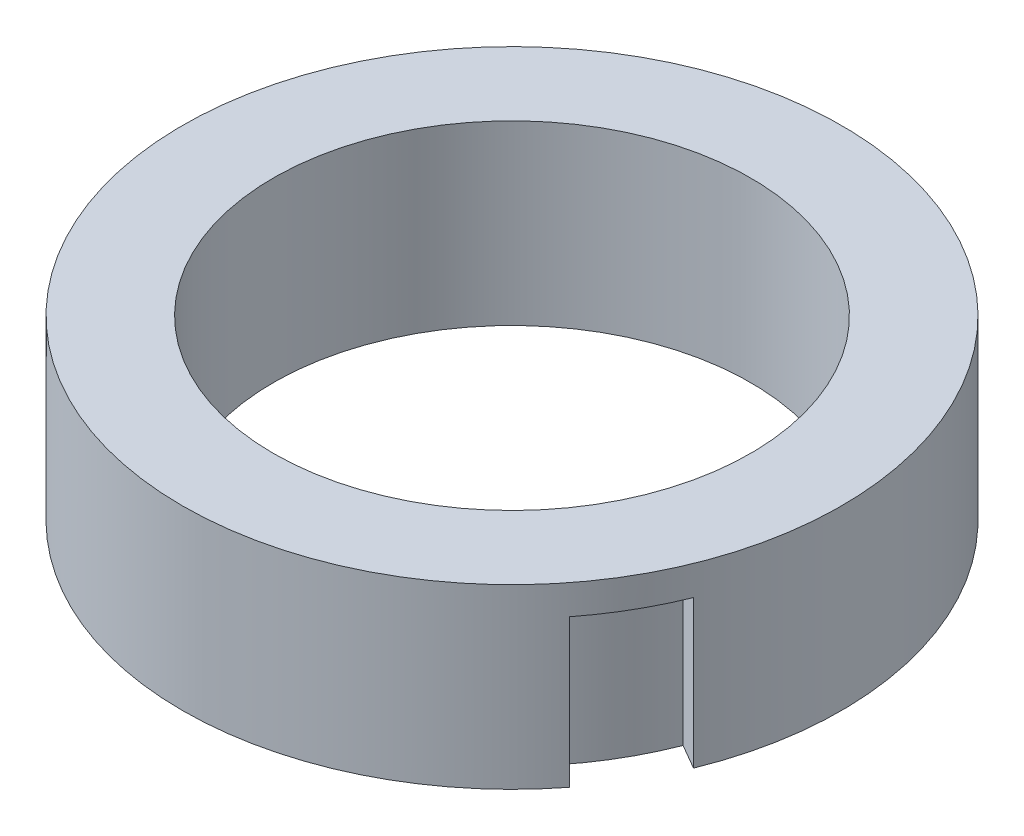
ISO-10303-21;
HEADER;
FILE_DESCRIPTION(('STEP AP214'),'2;1');
FILE_NAME('part.step','',(''),(''),'','','');
FILE_SCHEMA(('AUTOMOTIVE_DESIGN { 1 0 10303 214 1 1 1 1 }'));
ENDSEC;
DATA;
#1=APPLICATION_CONTEXT('core data for automotive mechanical design processes');
#2=APPLICATION_PROTOCOL_DEFINITION('international standard','automotive_design',2000,#1);
#3=PRODUCT_CONTEXT('',#1,'mechanical');
#4=PRODUCT('Part','Part','',(#3));
#5=PRODUCT_RELATED_PRODUCT_CATEGORY('part','',(#4));
#6=PRODUCT_DEFINITION_FORMATION('','',#4);
#7=PRODUCT_DEFINITION_CONTEXT('part definition',#1,'design');
#8=PRODUCT_DEFINITION('design','',#6,#7);
#9=PRODUCT_DEFINITION_SHAPE('','',#8);
#10=(LENGTH_UNIT() NAMED_UNIT(*) SI_UNIT(.MILLI.,.METRE.));
#11=(NAMED_UNIT(*) PLANE_ANGLE_UNIT() SI_UNIT($,.RADIAN.));
#12=(NAMED_UNIT(*) SI_UNIT($,.STERADIAN.) SOLID_ANGLE_UNIT());
#13=UNCERTAINTY_MEASURE_WITH_UNIT(LENGTH_MEASURE(1.E-05),#10,'distance_accuracy_value','');
#14=(GEOMETRIC_REPRESENTATION_CONTEXT(3) GLOBAL_UNCERTAINTY_ASSIGNED_CONTEXT((#13)) GLOBAL_UNIT_ASSIGNED_CONTEXT((#10,
#11,#12)) REPRESENTATION_CONTEXT('',''));
#15=CARTESIAN_POINT('',(0.,0.,0.));
#16=DIRECTION('',(0.,0.,1.));
#17=DIRECTION('',(1.,0.,0.));
#18=AXIS2_PLACEMENT_3D('',#15,#16,#17);
#19=CARTESIAN_POINT('',(0.,-6.5,0.));
#20=DIRECTION('',(0.,1.,0.));
#21=DIRECTION('',(0.,0.,1.));
#22=AXIS2_PLACEMENT_3D('',#19,#20,#21);
#23=CYLINDRICAL_SURFACE('',#22,13.25);
#24=CARTESIAN_POINT('',(0.,0.,0.));
#25=DIRECTION('',(0.,1.,0.));
#26=DIRECTION('',(0.,0.,1.));
#27=AXIS2_PLACEMENT_3D('',#24,#25,#26);
#28=CIRCLE('',#27,13.25);
#29=CARTESIAN_POINT('',(10.3433625966906,0.,8.28114425628375));
#30=VERTEX_POINT('',#29);
#31=CARTESIAN_POINT('',(12.3433625966906,0.,4.81704264114599));
#32=VERTEX_POINT('',#31);
#33=EDGE_CURVE('E126',#30,#32,#28,.T.);
#34=ORIENTED_EDGE('',*,*,#33,.F.);
#35=DIRECTION('',(0.,1.,0.));
#36=VECTOR('',#35,1.);
#37=CARTESIAN_POINT('',(10.3433625966906,-6.5,8.28114425628375));
#38=LINE('',#37,#36);
#39=CARTESIAN_POINT('',(10.3433625966906,-6.5,8.28114425628375));
#40=VERTEX_POINT('',#39);
#41=EDGE_CURVE('E11',#40,#30,#38,.T.);
#42=ORIENTED_EDGE('',*,*,#41,.F.);
#43=CARTESIAN_POINT('',(0.,-6.5,0.));
#44=DIRECTION('',(0.,1.,0.));
#45=DIRECTION('',(0.,0.,1.));
#46=AXIS2_PLACEMENT_3D('',#43,#44,#45);
#47=CIRCLE('',#46,13.25);
#48=CARTESIAN_POINT('',(12.3433625966906,-6.5,4.81704264114599));
#49=VERTEX_POINT('',#48);
#50=EDGE_CURVE('E213',#40,#49,#47,.T.);
#51=ORIENTED_EDGE('',*,*,#50,.T.);
#52=DIRECTION('',(0.,1.,0.));
#53=VECTOR('',#52,1.);
#54=CARTESIAN_POINT('',(12.3433625966906,-6.5,4.81704264114599));
#55=LINE('',#54,#53);
#56=EDGE_CURVE('E39',#49,#32,#55,.T.);
#57=ORIENTED_EDGE('',*,*,#56,.T.);
#58=EDGE_LOOP('',(#34,#42,#51,#57));
#59=FACE_BOUND('',#58,.T.);
#60=ADVANCED_FACE('F35',(#59),#23,.T.);
#61=CARTESIAN_POINT('',(-1.,-6.5,1.73205080756888));
#62=DIRECTION('',(-0.5,0.,0.866025403784439));
#63=DIRECTION('',(0.866025403784439,0.,0.5));
#64=AXIS2_PLACEMENT_3D('',#61,#62,#63);
#65=PLANE('',#64);
#66=DIRECTION('',(0.866025403784439,0.,0.5));
#67=VECTOR('',#66,1.);
#68=CARTESIAN_POINT('',(-1.,0.,1.73205080756888));
#69=LINE('',#68,#67);
#70=CARTESIAN_POINT('',(11.4373429638328,0.,8.91275411574141));
#71=VERTEX_POINT('',#70);
#72=EDGE_CURVE('E176',#30,#71,#69,.T.);
#73=ORIENTED_EDGE('',*,*,#72,.T.);
#74=DIRECTION('',(0.,1.,0.));
#75=VECTOR('',#74,1.);
#76=CARTESIAN_POINT('',(11.4373429638328,-6.5,8.91275411574141));
#77=LINE('',#76,#75);
#78=CARTESIAN_POINT('',(11.4373429638328,-6.5,8.91275411574141));
#79=VERTEX_POINT('',#78);
#80=EDGE_CURVE('E45',#79,#71,#77,.T.);
#81=ORIENTED_EDGE('',*,*,#80,.F.);
#82=DIRECTION('',(0.866025403784439,0.,0.5));
#83=VECTOR('',#82,1.);
#84=CARTESIAN_POINT('',(-1.,-6.5,1.73205080756888));
#85=LINE('',#84,#83);
#86=EDGE_CURVE('E153',#40,#79,#85,.T.);
#87=ORIENTED_EDGE('',*,*,#86,.F.);
#88=ORIENTED_EDGE('',*,*,#41,.T.);
#89=EDGE_LOOP('',(#73,#81,#87,#88));
#90=FACE_BOUND('',#89,.T.);
#91=ADVANCED_FACE('F226',(#90),#65,.F.);
#92=CARTESIAN_POINT('',(0.,-6.5,0.));
#93=DIRECTION('',(0.,1.,0.));
#94=DIRECTION('',(0.,0.,1.));
#95=AXIS2_PLACEMENT_3D('',#92,#93,#94);
#96=CYLINDRICAL_SURFACE('',#95,14.5);
#97=ORIENTED_EDGE('',*,*,#80,.T.);
#98=CARTESIAN_POINT('',(0.,0.,0.));
#99=DIRECTION('',(0.,1.,0.));
#100=DIRECTION('',(0.,0.,1.));
#101=AXIS2_PLACEMENT_3D('',#98,#99,#100);
#102=CIRCLE('',#101,14.5);
#103=CARTESIAN_POINT('',(13.4373429638328,0.,5.44865250060366));
#104=VERTEX_POINT('',#103);
#105=EDGE_CURVE('E124',#71,#104,#102,.T.);
#106=ORIENTED_EDGE('',*,*,#105,.T.);
#107=DIRECTION('',(0.,1.,0.));
#108=VECTOR('',#107,1.);
#109=CARTESIAN_POINT('',(13.4373429638328,-6.5,5.44865250060366));
#110=LINE('',#109,#108);
#111=CARTESIAN_POINT('',(13.4373429638328,-6.5,5.44865250060366));
#112=VERTEX_POINT('',#111);
#113=EDGE_CURVE('E136',#112,#104,#110,.T.);
#114=ORIENTED_EDGE('',*,*,#113,.F.);
#115=CARTESIAN_POINT('',(0.,-6.5,0.));
#116=DIRECTION('',(0.,1.,0.));
#117=DIRECTION('',(0.,0.,1.));
#118=AXIS2_PLACEMENT_3D('',#115,#116,#117);
#119=CIRCLE('',#118,14.5);
#120=CARTESIAN_POINT('',(2.,-6.5,-14.3614066163451));
#121=VERTEX_POINT('',#120);
#122=EDGE_CURVE('E210',#112,#121,#119,.T.);
#123=ORIENTED_EDGE('',*,*,#122,.T.);
#124=DIRECTION('',(0.,1.,0.));
#125=VECTOR('',#124,1.);
#126=CARTESIAN_POINT('',(2.,-6.5,-14.3614066163451));
#127=LINE('',#126,#125);
#128=CARTESIAN_POINT('',(2.,0.,-14.3614066163451));
#129=VERTEX_POINT('',#128);
#130=EDGE_CURVE('E149',#121,#129,#127,.T.);
#131=ORIENTED_EDGE('',*,*,#130,.T.);
#132=CARTESIAN_POINT('',(-2.,0.,-14.3614066163451));
#133=VERTEX_POINT('',#132);
#134=EDGE_CURVE('E142',#129,#133,#102,.T.);
#135=ORIENTED_EDGE('',*,*,#134,.T.);
#136=DIRECTION('',(0.,1.,0.));
#137=VECTOR('',#136,1.);
#138=CARTESIAN_POINT('',(-2.,-6.5,-14.3614066163451));
#139=LINE('',#138,#137);
#140=CARTESIAN_POINT('',(-2.,-6.5,-14.3614066163451));
#141=VERTEX_POINT('',#140);
#142=EDGE_CURVE('E160',#141,#133,#139,.T.);
#143=ORIENTED_EDGE('',*,*,#142,.F.);
#144=CARTESIAN_POINT('',(0.,-6.5,0.));
#145=DIRECTION('',(0.,1.,0.));
#146=DIRECTION('',(0.,0.,1.));
#147=AXIS2_PLACEMENT_3D('',#144,#145,#146);
#148=CIRCLE('',#147,14.5);
#149=CARTESIAN_POINT('',(-13.4373429638327,-6.5,5.44865250060367));
#150=VERTEX_POINT('',#149);
#151=EDGE_CURVE('E201',#141,#150,#148,.T.);
#152=ORIENTED_EDGE('',*,*,#151,.T.);
#153=DIRECTION('',(0.,1.,0.));
#154=VECTOR('',#153,1.);
#155=CARTESIAN_POINT('',(-13.4373429638327,-6.5,5.44865250060367));
#156=LINE('',#155,#154);
#157=CARTESIAN_POINT('',(-13.4373429638327,0.,5.44865250060367));
#158=VERTEX_POINT('',#157);
#159=EDGE_CURVE('E163',#150,#158,#156,.T.);
#160=ORIENTED_EDGE('',*,*,#159,.T.);
#161=CARTESIAN_POINT('',(-11.4373429638327,0.,8.91275411574142));
#162=VERTEX_POINT('',#161);
#163=EDGE_CURVE('E144',#158,#162,#102,.T.);
#164=ORIENTED_EDGE('',*,*,#163,.T.);
#165=DIRECTION('',(0.,1.,0.));
#166=VECTOR('',#165,1.);
#167=CARTESIAN_POINT('',(-11.4373429638327,-6.5,8.91275411574142));
#168=LINE('',#167,#166);
#169=CARTESIAN_POINT('',(-11.4373429638327,-6.5,8.91275411574142));
#170=VERTEX_POINT('',#169);
#171=EDGE_CURVE('E172',#170,#162,#168,.T.);
#172=ORIENTED_EDGE('',*,*,#171,.F.);
#173=CARTESIAN_POINT('',(0.,-6.5,0.));
#174=DIRECTION('',(0.,1.,0.));
#175=DIRECTION('',(0.,0.,1.));
#176=AXIS2_PLACEMENT_3D('',#173,#174,#175);
#177=CIRCLE('',#176,14.5);
#178=EDGE_CURVE('E193',#170,#79,#177,.T.);
#179=ORIENTED_EDGE('',*,*,#178,.T.);
#180=EDGE_LOOP('',(#97,#106,#114,#123,#131,#135,#143,#152,#160,#164,#172,#179));
#181=FACE_BOUND('',#180,.T.);
#182=CARTESIAN_POINT('',(0.,1.3,0.));
#183=DIRECTION('',(0.,1.,0.));
#184=DIRECTION('',(0.,0.,1.));
#185=AXIS2_PLACEMENT_3D('',#182,#183,#184);
#186=CIRCLE('',#185,14.5);
#187=CARTESIAN_POINT('',(0.,1.3,14.5));
#188=VERTEX_POINT('',#187);
#189=EDGE_CURVE('E141',#188,#188,#186,.T.);
#190=ORIENTED_EDGE('',*,*,#189,.F.);
#191=EDGE_LOOP('',(#190));
#192=FACE_BOUND('',#191,.T.);
#193=ADVANCED_FACE('F133',(#181,#192),#96,.T.);
#194=CARTESIAN_POINT('',(0.999999999999998,-6.5,1.73205080756887));
#195=DIRECTION('',(-0.500000000000001,0.,-0.866025403784438));
#196=DIRECTION('',(-0.866025403784438,0.,0.500000000000001));
#197=AXIS2_PLACEMENT_3D('',#194,#195,#196);
#198=PLANE('',#197);
#199=DIRECTION('',(-0.866025403784438,0.,0.500000000000001));
#200=VECTOR('',#199,1.);
#201=CARTESIAN_POINT('',(0.999999999999998,0.,1.73205080756887));
#202=LINE('',#201,#200);
#203=CARTESIAN_POINT('',(-10.3433625966906,0.,8.28114425628375));
#204=VERTEX_POINT('',#203);
#205=EDGE_CURVE('E179',#204,#162,#202,.T.);
#206=ORIENTED_EDGE('',*,*,#205,.F.);
#207=DIRECTION('',(0.,1.,0.));
#208=VECTOR('',#207,1.);
#209=CARTESIAN_POINT('',(-10.3433625966906,-6.5,8.28114425628375));
#210=LINE('',#209,#208);
#211=CARTESIAN_POINT('',(-10.3433625966906,-6.5,8.28114425628375));
#212=VERTEX_POINT('',#211);
#213=EDGE_CURVE('E169',#212,#204,#210,.T.);
#214=ORIENTED_EDGE('',*,*,#213,.F.);
#215=DIRECTION('',(-0.866025403784438,0.,0.500000000000001));
#216=VECTOR('',#215,1.);
#217=CARTESIAN_POINT('',(0.999999999999998,-6.5,1.73205080756887));
#218=LINE('',#217,#216);
#219=EDGE_CURVE('E195',#212,#170,#218,.T.);
#220=ORIENTED_EDGE('',*,*,#219,.T.);
#221=ORIENTED_EDGE('',*,*,#171,.T.);
#222=EDGE_LOOP('',(#206,#214,#220,#221));
#223=FACE_BOUND('',#222,.T.);
#224=ADVANCED_FACE('F225',(#223),#198,.T.);
#225=CARTESIAN_POINT('',(-12.3433625966906,0.,4.817042641146));
#226=VERTEX_POINT('',#225);
#227=EDGE_CURVE('E181',#226,#204,#28,.T.);
#228=ORIENTED_EDGE('',*,*,#227,.F.);
#229=DIRECTION('',(0.,1.,0.));
#230=VECTOR('',#229,1.);
#231=CARTESIAN_POINT('',(-12.3433625966906,-6.5,4.817042641146));
#232=LINE('',#231,#230);
#233=CARTESIAN_POINT('',(-12.3433625966906,-6.5,4.817042641146));
#234=VERTEX_POINT('',#233);
#235=EDGE_CURVE('E166',#234,#226,#232,.T.);
#236=ORIENTED_EDGE('',*,*,#235,.F.);
#237=EDGE_CURVE('E198',#234,#212,#47,.T.);
#238=ORIENTED_EDGE('',*,*,#237,.T.);
#239=ORIENTED_EDGE('',*,*,#213,.T.);
#240=EDGE_LOOP('',(#228,#236,#238,#239));
#241=FACE_BOUND('',#240,.T.);
#242=ADVANCED_FACE('F232',(#241),#23,.T.);
#243=CARTESIAN_POINT('',(-1.,-6.5,-1.73205080756888));
#244=DIRECTION('',(-0.5,0.,-0.866025403784438));
#245=DIRECTION('',(-0.866025403784439,0.,0.5));
#246=AXIS2_PLACEMENT_3D('',#243,#244,#245);
#247=PLANE('',#246);
#248=DIRECTION('',(-0.866025403784438,0.,0.5));
#249=VECTOR('',#248,1.);
#250=CARTESIAN_POINT('',(-1.,0.,-1.73205080756888));
#251=LINE('',#250,#249);
#252=EDGE_CURVE('E182',#226,#158,#251,.T.);
#253=ORIENTED_EDGE('',*,*,#252,.T.);
#254=ORIENTED_EDGE('',*,*,#159,.F.);
#255=DIRECTION('',(-0.866025403784438,0.,0.5));
#256=VECTOR('',#255,1.);
#257=CARTESIAN_POINT('',(-1.,-6.5,-1.73205080756888));
#258=LINE('',#257,#256);
#259=EDGE_CURVE('E199',#234,#150,#258,.T.);
#260=ORIENTED_EDGE('',*,*,#259,.F.);
#261=ORIENTED_EDGE('',*,*,#235,.T.);
#262=EDGE_LOOP('',(#253,#254,#260,#261));
#263=FACE_BOUND('',#262,.T.);
#264=ADVANCED_FACE('F248',(#263),#247,.F.);
#265=CARTESIAN_POINT('',(-2.,-6.5,0.));
#266=DIRECTION('',(1.,0.,0.));
#267=DIRECTION('',(0.,0.,-1.));
#268=AXIS2_PLACEMENT_3D('',#265,#266,#267);
#269=PLANE('',#268);
#270=DIRECTION('',(0.,0.,-1.));
#271=VECTOR('',#270,1.);
#272=CARTESIAN_POINT('',(-2.,0.,0.));
#273=LINE('',#272,#271);
#274=CARTESIAN_POINT('',(-2.,0.,-13.0981868974297));
#275=VERTEX_POINT('',#274);
#276=EDGE_CURVE('E185',#275,#133,#273,.T.);
#277=ORIENTED_EDGE('',*,*,#276,.F.);
#278=DIRECTION('',(0.,1.,0.));
#279=VECTOR('',#278,1.);
#280=CARTESIAN_POINT('',(-2.,-6.5,-13.0981868974297));
#281=LINE('',#280,#279);
#282=CARTESIAN_POINT('',(-2.,-6.5,-13.0981868974297));
#283=VERTEX_POINT('',#282);
#284=EDGE_CURVE('E157',#283,#275,#281,.T.);
#285=ORIENTED_EDGE('',*,*,#284,.F.);
#286=DIRECTION('',(0.,0.,-1.));
#287=VECTOR('',#286,1.);
#288=CARTESIAN_POINT('',(-2.,-6.5,0.));
#289=LINE('',#288,#287);
#290=EDGE_CURVE('E204',#283,#141,#289,.T.);
#291=ORIENTED_EDGE('',*,*,#290,.T.);
#292=ORIENTED_EDGE('',*,*,#142,.T.);
#293=EDGE_LOOP('',(#277,#285,#291,#292));
#294=FACE_BOUND('',#293,.T.);
#295=ADVANCED_FACE('F245',(#294),#269,.T.);
#296=CARTESIAN_POINT('',(2.,0.,-13.0981868974297));
#297=VERTEX_POINT('',#296);
#298=EDGE_CURVE('E187',#297,#275,#28,.T.);
#299=ORIENTED_EDGE('',*,*,#298,.F.);
#300=DIRECTION('',(0.,1.,0.));
#301=VECTOR('',#300,1.);
#302=CARTESIAN_POINT('',(2.,-6.5,-13.0981868974297));
#303=LINE('',#302,#301);
#304=CARTESIAN_POINT('',(2.,-6.5,-13.0981868974297));
#305=VERTEX_POINT('',#304);
#306=EDGE_CURVE('E151',#305,#297,#303,.T.);
#307=ORIENTED_EDGE('',*,*,#306,.F.);
#308=EDGE_CURVE('E207',#305,#283,#47,.T.);
#309=ORIENTED_EDGE('',*,*,#308,.T.);
#310=ORIENTED_EDGE('',*,*,#284,.T.);
#311=EDGE_LOOP('',(#299,#307,#309,#310));
#312=FACE_BOUND('',#311,.T.);
#313=ADVANCED_FACE('F239',(#312),#23,.T.);
#314=CARTESIAN_POINT('',(2.,-6.5,0.));
#315=DIRECTION('',(1.,0.,0.));
#316=DIRECTION('',(0.,0.,-1.));
#317=AXIS2_PLACEMENT_3D('',#314,#315,#316);
#318=PLANE('',#317);
#319=DIRECTION('',(0.,0.,-1.));
#320=VECTOR('',#319,1.);
#321=CARTESIAN_POINT('',(2.,0.,0.));
#322=LINE('',#321,#320);
#323=EDGE_CURVE('E130',#297,#129,#322,.T.);
#324=ORIENTED_EDGE('',*,*,#323,.T.);
#325=ORIENTED_EDGE('',*,*,#130,.F.);
#326=DIRECTION('',(0.,0.,-1.));
#327=VECTOR('',#326,1.);
#328=CARTESIAN_POINT('',(2.,-6.5,0.));
#329=LINE('',#328,#327);
#330=EDGE_CURVE('E208',#305,#121,#329,.T.);
#331=ORIENTED_EDGE('',*,*,#330,.F.);
#332=ORIENTED_EDGE('',*,*,#306,.T.);
#333=EDGE_LOOP('',(#324,#325,#331,#332));
#334=FACE_BOUND('',#333,.T.);
#335=ADVANCED_FACE('F244',(#334),#318,.F.);
#336=CARTESIAN_POINT('',(0.,-6.5,0.));
#337=DIRECTION('',(0.,1.,0.));
#338=DIRECTION('',(0.,0.,1.));
#339=AXIS2_PLACEMENT_3D('',#336,#337,#338);
#340=CYLINDRICAL_SURFACE('',#339,10.5);
#341=CARTESIAN_POINT('',(0.,-6.5,0.));
#342=DIRECTION('',(0.,1.,0.));
#343=DIRECTION('',(0.,0.,1.));
#344=AXIS2_PLACEMENT_3D('',#341,#342,#343);
#345=CIRCLE('',#344,10.5);
#346=CARTESIAN_POINT('',(0.,-6.5,10.5));
#347=VERTEX_POINT('',#346);
#348=EDGE_CURVE('E178',#347,#347,#345,.T.);
#349=CARTESIAN_POINT('',(0.,1.3,0.));
#350=DIRECTION('',(0.,1.,0.));
#351=DIRECTION('',(0.,0.,1.));
#352=AXIS2_PLACEMENT_3D('',#349,#350,#351);
#353=CIRCLE('',#352,10.5);
#354=CARTESIAN_POINT('',(0.,1.3,10.5));
#355=VERTEX_POINT('',#354);
#356=EDGE_CURVE('E191',#355,#355,#353,.T.);
#357=CARTESIAN_POINT('',(0.,-6.5,10.5));
#358=CARTESIAN_POINT('',(0.,-6.41875,10.5));
#359=CARTESIAN_POINT('',(0.,-6.3375,10.5));
#360=CARTESIAN_POINT('',(0.,-6.175,10.5));
#361=CARTESIAN_POINT('',(0.,-6.09375,10.5));
#362=CARTESIAN_POINT('',(0.,-5.93125,10.5));
#363=CARTESIAN_POINT('',(0.,-5.85,10.5));
#364=CARTESIAN_POINT('',(0.,-5.6875,10.5));
#365=CARTESIAN_POINT('',(0.,-5.60625,10.5));
#366=CARTESIAN_POINT('',(0.,-5.44375,10.5));
#367=CARTESIAN_POINT('',(0.,-5.3625,10.5));
#368=CARTESIAN_POINT('',(0.,-5.2,10.5));
#369=CARTESIAN_POINT('',(0.,-5.11875,10.5));
#370=CARTESIAN_POINT('',(0.,-4.95625,10.5));
#371=CARTESIAN_POINT('',(0.,-4.875,10.5));
#372=CARTESIAN_POINT('',(0.,-4.7125,10.5));
#373=CARTESIAN_POINT('',(0.,-4.63125,10.5));
#374=CARTESIAN_POINT('',(0.,-4.46875,10.5));
#375=CARTESIAN_POINT('',(0.,-4.3875,10.5));
#376=CARTESIAN_POINT('',(0.,-4.225,10.5));
#377=CARTESIAN_POINT('',(0.,-4.14375,10.5));
#378=CARTESIAN_POINT('',(0.,-3.98125,10.5));
#379=CARTESIAN_POINT('',(0.,-3.9,10.5));
#380=CARTESIAN_POINT('',(0.,-3.7375,10.5));
#381=CARTESIAN_POINT('',(0.,-3.65625,10.5));
#382=CARTESIAN_POINT('',(0.,-3.49375,10.5));
#383=CARTESIAN_POINT('',(0.,-3.4125,10.5));
#384=CARTESIAN_POINT('',(0.,-3.25,10.5));
#385=CARTESIAN_POINT('',(0.,-3.16875,10.5));
#386=CARTESIAN_POINT('',(0.,-3.00625,10.5));
#387=CARTESIAN_POINT('',(0.,-2.925,10.5));
#388=CARTESIAN_POINT('',(0.,-2.7625,10.5));
#389=CARTESIAN_POINT('',(0.,-2.68125,10.5));
#390=CARTESIAN_POINT('',(0.,-2.51875,10.5));
#391=CARTESIAN_POINT('',(0.,-2.4375,10.5));
#392=CARTESIAN_POINT('',(0.,-2.275,10.5));
#393=CARTESIAN_POINT('',(0.,-2.19375,10.5));
#394=CARTESIAN_POINT('',(0.,-2.03125,10.5));
#395=CARTESIAN_POINT('',(0.,-1.95,10.5));
#396=CARTESIAN_POINT('',(0.,-1.7875,10.5));
#397=CARTESIAN_POINT('',(0.,-1.70625,10.5));
#398=CARTESIAN_POINT('',(0.,-1.54375,10.5));
#399=CARTESIAN_POINT('',(0.,-1.4625,10.5));
#400=CARTESIAN_POINT('',(0.,-1.3,10.5));
#401=CARTESIAN_POINT('',(0.,-1.21875,10.5));
#402=CARTESIAN_POINT('',(0.,-1.05625,10.5));
#403=CARTESIAN_POINT('',(0.,-0.975,10.5));
#404=CARTESIAN_POINT('',(0.,-0.812500000000001,10.5));
#405=CARTESIAN_POINT('',(0.,-0.731250000000001,10.5));
#406=CARTESIAN_POINT('',(0.,-0.568750000000001,10.5));
#407=CARTESIAN_POINT('',(0.,-0.487500000000001,10.5));
#408=CARTESIAN_POINT('',(0.,-0.325000000000001,10.5));
#409=CARTESIAN_POINT('',(0.,-0.243750000000001,10.5));
#410=CARTESIAN_POINT('',(0.,-0.0812500000000012,10.5));
#411=CARTESIAN_POINT('',(0.,0.,10.5));
#412=CARTESIAN_POINT('',(0.,0.162499999999999,10.5));
#413=CARTESIAN_POINT('',(0.,0.243749999999999,10.5));
#414=CARTESIAN_POINT('',(0.,0.406249999999999,10.5));
#415=CARTESIAN_POINT('',(0.,0.487499999999999,10.5));
#416=CARTESIAN_POINT('',(0.,0.649999999999999,10.5));
#417=CARTESIAN_POINT('',(0.,0.731249999999999,10.5));
#418=CARTESIAN_POINT('',(0.,0.893749999999999,10.5));
#419=CARTESIAN_POINT('',(0.,0.974999999999999,10.5));
#420=CARTESIAN_POINT('',(0.,1.1375,10.5));
#421=CARTESIAN_POINT('',(0.,1.21875,10.5));
#422=CARTESIAN_POINT('',(0.,1.3,10.5));
#423=B_SPLINE_CURVE_WITH_KNOTS('',3,(#357,#358,#359,#360,#361,#362,#363,#364,#365,#366,#367,
#368,#369,#370,#371,#372,#373,#374,#375,#376,#377,#378,#379,#380,#381,#382,#383,#384,#385,#386,
#387,#388,#389,#390,#391,#392,#393,#394,#395,#396,#397,#398,#399,#400,#401,#402,#403,#404,#405,
#406,#407,#408,#409,#410,#411,#412,#413,#414,#415,#416,#417,#418,#419,#420,#421,#422),
.UNSPECIFIED.,.F.,.F.,(4,2,2,2,2,2,2,2,2,2,2,2,2,2,2,2,2,2,2,2,2,2,2,2,2,2,2,2,2,2,2,2,4),(0.,
0.243749999999999,0.487499999999999,0.731249999999999,0.974999999999999,1.21875,1.4625,1.70625,
1.95,2.19375,2.4375,2.68125,2.925,3.16875,3.4125,3.65625,3.9,4.14375,4.3875,4.63125,4.875,
5.11875,5.3625,5.60625,5.85,6.09375,6.3375,6.58125,6.825,7.06875,7.3125,7.55625,7.8),.UNSPECIFIED.);
#424=EDGE_CURVE('BSEAM37',#347,#355,#423,.T.);
#425=ORIENTED_EDGE('',*,*,#348,.F.);
#426=ORIENTED_EDGE('',*,*,#356,.T.);
#427=ORIENTED_EDGE('',*,*,#424,.T.);
#428=ORIENTED_EDGE('',*,*,#424,.F.);
#429=EDGE_LOOP('',(#425,#427,#426,#428));
#430=FACE_BOUND('',#429,.T.);
#431=ADVANCED_FACE('F37',(#430),#340,.F.);
#432=CARTESIAN_POINT('',(1.,-6.5,-1.73205080756888));
#433=DIRECTION('',(-0.5,0.,0.866025403784439));
#434=DIRECTION('',(0.866025403784439,0.,0.5));
#435=AXIS2_PLACEMENT_3D('',#432,#433,#434);
#436=PLANE('',#435);
#437=DIRECTION('',(0.866025403784439,0.,0.5));
#438=VECTOR('',#437,1.);
#439=CARTESIAN_POINT('',(1.,0.,-1.73205080756888));
#440=LINE('',#439,#438);
#441=EDGE_CURVE('E121',#32,#104,#440,.T.);
#442=ORIENTED_EDGE('',*,*,#441,.F.);
#443=ORIENTED_EDGE('',*,*,#56,.F.);
#444=DIRECTION('',(0.866025403784439,0.,0.5));
#445=VECTOR('',#444,1.);
#446=CARTESIAN_POINT('',(1.,-6.5,-1.73205080756888));
#447=LINE('',#446,#445);
#448=EDGE_CURVE('E148',#49,#112,#447,.T.);
#449=ORIENTED_EDGE('',*,*,#448,.T.);
#450=ORIENTED_EDGE('',*,*,#113,.T.);
#451=EDGE_LOOP('',(#442,#443,#449,#450));
#452=FACE_BOUND('',#451,.T.);
#453=ADVANCED_FACE('F146',(#452),#436,.T.);
#454=CARTESIAN_POINT('',(0.,-6.5,0.));
#455=DIRECTION('',(0.,1.,0.));
#456=DIRECTION('',(0.,0.,1.));
#457=AXIS2_PLACEMENT_3D('',#454,#455,#456);
#458=PLANE('',#457);
#459=ORIENTED_EDGE('',*,*,#348,.T.);
#460=EDGE_LOOP('',(#459));
#461=FACE_BOUND('',#460,.T.);
#462=ORIENTED_EDGE('',*,*,#50,.F.);
#463=ORIENTED_EDGE('',*,*,#86,.T.);
#464=ORIENTED_EDGE('',*,*,#178,.F.);
#465=ORIENTED_EDGE('',*,*,#219,.F.);
#466=ORIENTED_EDGE('',*,*,#237,.F.);
#467=ORIENTED_EDGE('',*,*,#259,.T.);
#468=ORIENTED_EDGE('',*,*,#151,.F.);
#469=ORIENTED_EDGE('',*,*,#290,.F.);
#470=ORIENTED_EDGE('',*,*,#308,.F.);
#471=ORIENTED_EDGE('',*,*,#330,.T.);
#472=ORIENTED_EDGE('',*,*,#122,.F.);
#473=ORIENTED_EDGE('',*,*,#448,.F.);
#474=EDGE_LOOP('',(#462,#463,#464,#465,#466,#467,#468,#469,#470,#471,#472,#473));
#475=FACE_BOUND('',#474,.T.);
#476=ADVANCED_FACE('F271',(#461,#475),#458,.F.);
#477=CARTESIAN_POINT('',(0.,0.,0.));
#478=DIRECTION('',(0.,1.,0.));
#479=DIRECTION('',(0.,0.,1.));
#480=AXIS2_PLACEMENT_3D('',#477,#478,#479);
#481=PLANE('',#480);
#482=ORIENTED_EDGE('',*,*,#323,.F.);
#483=ORIENTED_EDGE('',*,*,#298,.T.);
#484=ORIENTED_EDGE('',*,*,#276,.T.);
#485=ORIENTED_EDGE('',*,*,#134,.F.);
#486=EDGE_LOOP('',(#482,#483,#484,#485));
#487=FACE_BOUND('',#486,.T.);
#488=ADVANCED_FACE('F261',(#487),#481,.F.);
#489=ORIENTED_EDGE('',*,*,#33,.T.);
#490=ORIENTED_EDGE('',*,*,#441,.T.);
#491=ORIENTED_EDGE('',*,*,#105,.F.);
#492=ORIENTED_EDGE('',*,*,#72,.F.);
#493=EDGE_LOOP('',(#489,#490,#491,#492));
#494=FACE_BOUND('',#493,.T.);
#495=ADVANCED_FACE('F123',(#494),#481,.F.);
#496=CARTESIAN_POINT('',(0.,1.3,0.));
#497=DIRECTION('',(0.,1.,0.));
#498=DIRECTION('',(0.,0.,1.));
#499=AXIS2_PLACEMENT_3D('',#496,#497,#498);
#500=PLANE('',#499);
#501=ORIENTED_EDGE('',*,*,#189,.T.);
#502=EDGE_LOOP('',(#501));
#503=FACE_BOUND('',#502,.T.);
#504=ORIENTED_EDGE('',*,*,#356,.F.);
#505=EDGE_LOOP('',(#504));
#506=FACE_BOUND('',#505,.T.);
#507=ADVANCED_FACE('F222',(#503,#506),#500,.T.);
#508=ORIENTED_EDGE('',*,*,#252,.F.);
#509=ORIENTED_EDGE('',*,*,#227,.T.);
#510=ORIENTED_EDGE('',*,*,#205,.T.);
#511=ORIENTED_EDGE('',*,*,#163,.F.);
#512=EDGE_LOOP('',(#508,#509,#510,#511));
#513=FACE_BOUND('',#512,.T.);
#514=ADVANCED_FACE('F297',(#513),#481,.F.);
#515=CLOSED_SHELL('',(#60,#91,#193,#224,#242,#264,#295,#313,#335,#431,#453,#476,#488,#495,#507,#514));
#516=MANIFOLD_SOLID_BREP('B2',#515);
#517=ADVANCED_BREP_SHAPE_REPRESENTATION('',(#18,#516),#14);
#518=SHAPE_DEFINITION_REPRESENTATION(#9,#517);
ENDSEC;
END-ISO-10303-21;
